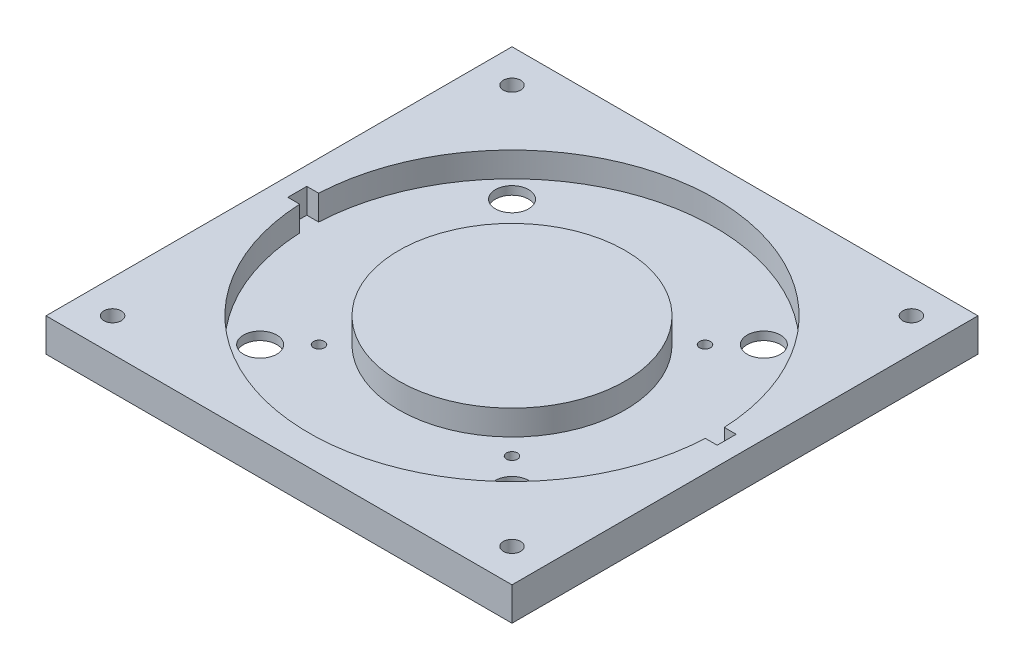
ISO-10303-21;
HEADER;
FILE_DESCRIPTION(('STEP AP214'),'2;1');
FILE_NAME('part.step','',(''),(''),'','','');
FILE_SCHEMA(('AUTOMOTIVE_DESIGN { 1 0 10303 214 1 1 1 1 }'));
ENDSEC;
DATA;
#1=APPLICATION_CONTEXT('core data for automotive mechanical design processes');
#2=APPLICATION_PROTOCOL_DEFINITION('international standard','automotive_design',2000,#1);
#3=PRODUCT_CONTEXT('',#1,'mechanical');
#4=PRODUCT('Part','Part','',(#3));
#5=PRODUCT_RELATED_PRODUCT_CATEGORY('part','',(#4));
#6=PRODUCT_DEFINITION_FORMATION('','',#4);
#7=PRODUCT_DEFINITION_CONTEXT('part definition',#1,'design');
#8=PRODUCT_DEFINITION('design','',#6,#7);
#9=PRODUCT_DEFINITION_SHAPE('','',#8);
#10=(LENGTH_UNIT() NAMED_UNIT(*) SI_UNIT(.MILLI.,.METRE.));
#11=(NAMED_UNIT(*) PLANE_ANGLE_UNIT() SI_UNIT($,.RADIAN.));
#12=(NAMED_UNIT(*) SI_UNIT($,.STERADIAN.) SOLID_ANGLE_UNIT());
#13=UNCERTAINTY_MEASURE_WITH_UNIT(LENGTH_MEASURE(1.E-05),#10,'distance_accuracy_value','');
#14=(GEOMETRIC_REPRESENTATION_CONTEXT(3) GLOBAL_UNCERTAINTY_ASSIGNED_CONTEXT((#13)) GLOBAL_UNIT_ASSIGNED_CONTEXT((#10,
#11,#12)) REPRESENTATION_CONTEXT('',''));
#15=CARTESIAN_POINT('',(0.,0.,0.));
#16=DIRECTION('',(0.,0.,1.));
#17=DIRECTION('',(1.,0.,0.));
#18=AXIS2_PLACEMENT_3D('',#15,#16,#17);
#19=CARTESIAN_POINT('',(0.,2.5,0.));
#20=DIRECTION('',(0.,1.,0.));
#21=DIRECTION('',(0.,0.,1.));
#22=AXIS2_PLACEMENT_3D('',#19,#20,#21);
#23=CYLINDRICAL_SURFACE('',#22,61.);
#24=CARTESIAN_POINT('',(0.,2.5,0.));
#25=DIRECTION('',(0.,1.,0.));
#26=DIRECTION('',(0.,0.,1.));
#27=AXIS2_PLACEMENT_3D('',#24,#25,#26);
#28=CIRCLE('',#27,61.);
#29=CARTESIAN_POINT('',(-60.9333857585478,2.5,2.85));
#30=VERTEX_POINT('',#29);
#31=CARTESIAN_POINT('',(60.9333857585478,2.5,2.85));
#32=VERTEX_POINT('',#31);
#33=EDGE_CURVE('E203',#30,#32,#28,.T.);
#34=ORIENTED_EDGE('',*,*,#33,.F.);
#35=DIRECTION('',(0.,1.,0.));
#36=VECTOR('',#35,1.);
#37=CARTESIAN_POINT('',(-60.9333857585478,2.5,2.85));
#38=LINE('',#37,#36);
#39=CARTESIAN_POINT('',(-60.9333857585478,10.,2.85));
#40=VERTEX_POINT('',#39);
#41=EDGE_CURVE('E181',#30,#40,#38,.T.);
#42=ORIENTED_EDGE('',*,*,#41,.T.);
#43=CARTESIAN_POINT('',(0.,10.,0.));
#44=DIRECTION('',(0.,1.,0.));
#45=DIRECTION('',(0.,0.,1.));
#46=AXIS2_PLACEMENT_3D('',#43,#44,#45);
#47=CIRCLE('',#46,61.);
#48=CARTESIAN_POINT('',(60.9333857585478,10.,2.85));
#49=VERTEX_POINT('',#48);
#50=EDGE_CURVE('E202',#40,#49,#47,.T.);
#51=ORIENTED_EDGE('',*,*,#50,.T.);
#52=DIRECTION('',(0.,1.,0.));
#53=VECTOR('',#52,1.);
#54=CARTESIAN_POINT('',(60.9333857585478,2.5,2.85));
#55=LINE('',#54,#53);
#56=EDGE_CURVE('E177',#49,#32,#55,.F.);
#57=ORIENTED_EDGE('',*,*,#56,.T.);
#58=EDGE_LOOP('',(#34,#42,#51,#57));
#59=FACE_BOUND('',#58,.T.);
#60=ADVANCED_FACE('F34',(#59),#23,.F.);
#61=CARTESIAN_POINT('',(-28.9913780286484,10.,-28.9913780286484));
#62=DIRECTION('',(0.,-1.,0.));
#63=DIRECTION('',(0.,0.,-1.));
#64=AXIS2_PLACEMENT_3D('',#61,#62,#63);
#65=CYLINDRICAL_SURFACE('',#64,1.65);
#66=CARTESIAN_POINT('',(-28.9913780286484,0.,-28.9913780286484));
#67=DIRECTION('',(0.,1.,0.));
#68=DIRECTION('',(0.,0.,1.));
#69=AXIS2_PLACEMENT_3D('',#66,#67,#68);
#70=CIRCLE('',#69,1.65);
#71=CARTESIAN_POINT('',(-28.9913780286484,0.,-27.3413780286484));
#72=VERTEX_POINT('',#71);
#73=EDGE_CURVE('E260',#72,#72,#70,.T.);
#74=ORIENTED_EDGE('',*,*,#73,.F.);
#75=EDGE_LOOP('',(#74));
#76=FACE_BOUND('',#75,.T.);
#77=CARTESIAN_POINT('',(-28.9913780286484,2.5,-28.9913780286484));
#78=DIRECTION('',(0.,1.,0.));
#79=DIRECTION('',(0.,0.,1.));
#80=AXIS2_PLACEMENT_3D('',#77,#78,#79);
#81=CIRCLE('',#80,1.65);
#82=CARTESIAN_POINT('',(-28.9913780286484,2.5,-27.3413780286484));
#83=VERTEX_POINT('',#82);
#84=EDGE_CURVE('E199',#83,#83,#81,.T.);
#85=ORIENTED_EDGE('',*,*,#84,.T.);
#86=EDGE_LOOP('',(#85));
#87=FACE_BOUND('',#86,.T.);
#88=ADVANCED_FACE('F319',(#76,#87),#65,.F.);
#89=CARTESIAN_POINT('',(28.9913780286484,10.,-28.9913780286517));
#90=DIRECTION('',(0.,-1.,0.));
#91=DIRECTION('',(0.,0.,-1.));
#92=AXIS2_PLACEMENT_3D('',#89,#90,#91);
#93=CYLINDRICAL_SURFACE('',#92,1.65);
#94=CARTESIAN_POINT('',(28.9913780286484,0.,-28.9913780286517));
#95=DIRECTION('',(0.,1.,0.));
#96=DIRECTION('',(0.,0.,1.));
#97=AXIS2_PLACEMENT_3D('',#94,#95,#96);
#98=CIRCLE('',#97,1.65);
#99=CARTESIAN_POINT('',(28.9913780286484,0.,-27.3413780286517));
#100=VERTEX_POINT('',#99);
#101=EDGE_CURVE('E254',#100,#100,#98,.T.);
#102=ORIENTED_EDGE('',*,*,#101,.F.);
#103=EDGE_LOOP('',(#102));
#104=FACE_BOUND('',#103,.T.);
#105=CARTESIAN_POINT('',(28.9913780286484,2.5,-28.9913780286517));
#106=DIRECTION('',(0.,1.,0.));
#107=DIRECTION('',(0.,0.,1.));
#108=AXIS2_PLACEMENT_3D('',#105,#106,#107);
#109=CIRCLE('',#108,1.65);
#110=CARTESIAN_POINT('',(28.9913780286484,2.5,-27.3413780286517));
#111=VERTEX_POINT('',#110);
#112=EDGE_CURVE('E196',#111,#111,#109,.T.);
#113=ORIENTED_EDGE('',*,*,#112,.T.);
#114=EDGE_LOOP('',(#113));
#115=FACE_BOUND('',#114,.T.);
#116=ADVANCED_FACE('F326',(#104,#115),#93,.F.);
#117=CARTESIAN_POINT('',(28.9913780286517,10.,28.9913780286451));
#118=DIRECTION('',(0.,-1.,0.));
#119=DIRECTION('',(0.,0.,-1.));
#120=AXIS2_PLACEMENT_3D('',#117,#118,#119);
#121=CYLINDRICAL_SURFACE('',#120,1.65);
#122=CARTESIAN_POINT('',(28.9913780286517,0.,28.9913780286451));
#123=DIRECTION('',(0.,1.,0.));
#124=DIRECTION('',(0.,0.,1.));
#125=AXIS2_PLACEMENT_3D('',#122,#123,#124);
#126=CIRCLE('',#125,1.65);
#127=CARTESIAN_POINT('',(28.9913780286517,0.,30.6413780286451));
#128=VERTEX_POINT('',#127);
#129=EDGE_CURVE('E248',#128,#128,#126,.T.);
#130=ORIENTED_EDGE('',*,*,#129,.F.);
#131=EDGE_LOOP('',(#130));
#132=FACE_BOUND('',#131,.T.);
#133=CARTESIAN_POINT('',(28.9913780286517,2.5,28.9913780286451));
#134=DIRECTION('',(0.,1.,0.));
#135=DIRECTION('',(0.,0.,1.));
#136=AXIS2_PLACEMENT_3D('',#133,#134,#135);
#137=CIRCLE('',#136,1.65);
#138=CARTESIAN_POINT('',(28.9913780286517,2.5,30.6413780286451));
#139=VERTEX_POINT('',#138);
#140=EDGE_CURVE('E193',#139,#139,#137,.T.);
#141=ORIENTED_EDGE('',*,*,#140,.T.);
#142=EDGE_LOOP('',(#141));
#143=FACE_BOUND('',#142,.T.);
#144=ADVANCED_FACE('F411',(#132,#143),#121,.F.);
#145=CARTESIAN_POINT('',(-28.9913780286451,10.,28.9913780286484));
#146=DIRECTION('',(0.,-1.,0.));
#147=DIRECTION('',(0.,0.,-1.));
#148=AXIS2_PLACEMENT_3D('',#145,#146,#147);
#149=CYLINDRICAL_SURFACE('',#148,1.65);
#150=CARTESIAN_POINT('',(-28.9913780286451,0.,28.9913780286484));
#151=DIRECTION('',(0.,1.,0.));
#152=DIRECTION('',(0.,0.,1.));
#153=AXIS2_PLACEMENT_3D('',#150,#151,#152);
#154=CIRCLE('',#153,1.65);
#155=CARTESIAN_POINT('',(-28.9913780286451,0.,30.6413780286484));
#156=VERTEX_POINT('',#155);
#157=EDGE_CURVE('E240',#156,#156,#154,.T.);
#158=ORIENTED_EDGE('',*,*,#157,.F.);
#159=EDGE_LOOP('',(#158));
#160=FACE_BOUND('',#159,.T.);
#161=CARTESIAN_POINT('',(-28.9913780286451,2.5,28.9913780286484));
#162=DIRECTION('',(0.,1.,0.));
#163=DIRECTION('',(0.,0.,1.));
#164=AXIS2_PLACEMENT_3D('',#161,#162,#163);
#165=CIRCLE('',#164,1.65);
#166=CARTESIAN_POINT('',(-28.9913780286451,2.5,30.6413780286484));
#167=VERTEX_POINT('',#166);
#168=EDGE_CURVE('E188',#167,#167,#165,.T.);
#169=ORIENTED_EDGE('',*,*,#168,.T.);
#170=EDGE_LOOP('',(#169));
#171=FACE_BOUND('',#170,.T.);
#172=ADVANCED_FACE('F409',(#160,#171),#149,.F.);
#173=CARTESIAN_POINT('',(-37.8302127934803,10.,-37.8302127934803));
#174=DIRECTION('',(0.,-1.,0.));
#175=DIRECTION('',(0.,0.,-1.));
#176=AXIS2_PLACEMENT_3D('',#173,#174,#175);
#177=CYLINDRICAL_SURFACE('',#176,5.);
#178=CARTESIAN_POINT('',(-37.8302127934803,0.,-37.8302127934803));
#179=DIRECTION('',(0.,1.,0.));
#180=DIRECTION('',(0.,0.,1.));
#181=AXIS2_PLACEMENT_3D('',#178,#179,#180);
#182=CIRCLE('',#181,5.);
#183=CARTESIAN_POINT('',(-37.8302127934803,0.,-32.8302127934803));
#184=VERTEX_POINT('',#183);
#185=EDGE_CURVE('E263',#184,#184,#182,.T.);
#186=ORIENTED_EDGE('',*,*,#185,.F.);
#187=EDGE_LOOP('',(#186));
#188=FACE_BOUND('',#187,.T.);
#189=CARTESIAN_POINT('',(-37.8302127934803,2.5,-37.8302127934803));
#190=DIRECTION('',(0.,1.,0.));
#191=DIRECTION('',(0.,0.,1.));
#192=AXIS2_PLACEMENT_3D('',#189,#190,#191);
#193=CIRCLE('',#192,5.);
#194=CARTESIAN_POINT('',(-37.8302127934803,2.5,-32.8302127934803));
#195=VERTEX_POINT('',#194);
#196=EDGE_CURVE('E215',#195,#195,#193,.T.);
#197=ORIENTED_EDGE('',*,*,#196,.T.);
#198=EDGE_LOOP('',(#197));
#199=FACE_BOUND('',#198,.T.);
#200=ADVANCED_FACE('F419',(#188,#199),#177,.F.);
#201=CARTESIAN_POINT('',(37.8302127934803,10.,-37.8302127934835));
#202=DIRECTION('',(0.,-1.,0.));
#203=DIRECTION('',(0.,0.,-1.));
#204=AXIS2_PLACEMENT_3D('',#201,#202,#203);
#205=CYLINDRICAL_SURFACE('',#204,5.);
#206=CARTESIAN_POINT('',(37.8302127934803,0.,-37.8302127934835));
#207=DIRECTION('',(0.,1.,0.));
#208=DIRECTION('',(0.,0.,1.));
#209=AXIS2_PLACEMENT_3D('',#206,#207,#208);
#210=CIRCLE('',#209,5.);
#211=CARTESIAN_POINT('',(37.8302127934803,0.,-32.8302127934835));
#212=VERTEX_POINT('',#211);
#213=EDGE_CURVE('E257',#212,#212,#210,.T.);
#214=ORIENTED_EDGE('',*,*,#213,.F.);
#215=EDGE_LOOP('',(#214));
#216=FACE_BOUND('',#215,.T.);
#217=CARTESIAN_POINT('',(37.8302127934803,2.5,-37.8302127934835));
#218=DIRECTION('',(0.,1.,0.));
#219=DIRECTION('',(0.,0.,1.));
#220=AXIS2_PLACEMENT_3D('',#217,#218,#219);
#221=CIRCLE('',#220,5.);
#222=CARTESIAN_POINT('',(37.8302127934803,2.5,-32.8302127934835));
#223=VERTEX_POINT('',#222);
#224=EDGE_CURVE('E212',#223,#223,#221,.T.);
#225=ORIENTED_EDGE('',*,*,#224,.T.);
#226=EDGE_LOOP('',(#225));
#227=FACE_BOUND('',#226,.T.);
#228=ADVANCED_FACE('F403',(#216,#227),#205,.F.);
#229=CARTESIAN_POINT('',(37.8302127934835,10.,37.830212793477));
#230=DIRECTION('',(0.,-1.,0.));
#231=DIRECTION('',(0.,0.,-1.));
#232=AXIS2_PLACEMENT_3D('',#229,#230,#231);
#233=CYLINDRICAL_SURFACE('',#232,5.);
#234=CARTESIAN_POINT('',(37.8302127934835,0.,37.830212793477));
#235=DIRECTION('',(0.,1.,0.));
#236=DIRECTION('',(0.,0.,1.));
#237=AXIS2_PLACEMENT_3D('',#234,#235,#236);
#238=CIRCLE('',#237,5.);
#239=CARTESIAN_POINT('',(37.8302127934835,0.,42.830212793477));
#240=VERTEX_POINT('',#239);
#241=EDGE_CURVE('E251',#240,#240,#238,.T.);
#242=ORIENTED_EDGE('',*,*,#241,.F.);
#243=EDGE_LOOP('',(#242));
#244=FACE_BOUND('',#243,.T.);
#245=CARTESIAN_POINT('',(37.8302127934835,2.5,37.830212793477));
#246=DIRECTION('',(0.,1.,0.));
#247=DIRECTION('',(0.,0.,1.));
#248=AXIS2_PLACEMENT_3D('',#245,#246,#247);
#249=CIRCLE('',#248,5.);
#250=CARTESIAN_POINT('',(37.8302127934835,2.5,42.830212793477));
#251=VERTEX_POINT('',#250);
#252=EDGE_CURVE('E209',#251,#251,#249,.T.);
#253=ORIENTED_EDGE('',*,*,#252,.T.);
#254=EDGE_LOOP('',(#253));
#255=FACE_BOUND('',#254,.T.);
#256=ADVANCED_FACE('F397',(#244,#255),#233,.F.);
#257=CARTESIAN_POINT('',(-37.830212793477,10.,37.8302127934803));
#258=DIRECTION('',(0.,-1.,0.));
#259=DIRECTION('',(0.,0.,-1.));
#260=AXIS2_PLACEMENT_3D('',#257,#258,#259);
#261=CYLINDRICAL_SURFACE('',#260,5.);
#262=CARTESIAN_POINT('',(-37.830212793477,0.,37.8302127934803));
#263=DIRECTION('',(0.,1.,0.));
#264=DIRECTION('',(0.,0.,1.));
#265=AXIS2_PLACEMENT_3D('',#262,#263,#264);
#266=CIRCLE('',#265,5.);
#267=CARTESIAN_POINT('',(-37.830212793477,0.,42.8302127934803));
#268=VERTEX_POINT('',#267);
#269=EDGE_CURVE('E245',#268,#268,#266,.T.);
#270=ORIENTED_EDGE('',*,*,#269,.F.);
#271=EDGE_LOOP('',(#270));
#272=FACE_BOUND('',#271,.T.);
#273=CARTESIAN_POINT('',(-37.830212793477,2.5,37.8302127934803));
#274=DIRECTION('',(0.,1.,0.));
#275=DIRECTION('',(0.,0.,1.));
#276=AXIS2_PLACEMENT_3D('',#273,#274,#275);
#277=CIRCLE('',#276,5.);
#278=CARTESIAN_POINT('',(-37.830212793477,2.5,42.8302127934803));
#279=VERTEX_POINT('',#278);
#280=EDGE_CURVE('E38',#279,#279,#277,.T.);
#281=ORIENTED_EDGE('',*,*,#280,.T.);
#282=EDGE_LOOP('',(#281));
#283=FACE_BOUND('',#282,.T.);
#284=ADVANCED_FACE('F364',(#272,#283),#261,.F.);
#285=CARTESIAN_POINT('',(0.,10.,0.));
#286=DIRECTION('',(0.,-1.,0.));
#287=DIRECTION('',(0.,0.,-1.));
#288=AXIS2_PLACEMENT_3D('',#285,#286,#287);
#289=PLANE('',#288);
#290=ORIENTED_EDGE('',*,*,#50,.F.);
#291=DIRECTION('',(1.,0.,0.));
#292=VECTOR('',#291,1.);
#293=CARTESIAN_POINT('',(-64.5,10.,2.85));
#294=LINE('',#293,#292);
#295=CARTESIAN_POINT('',(-64.5,10.,2.85));
#296=VERTEX_POINT('',#295);
#297=EDGE_CURVE('E145',#296,#40,#294,.T.);
#298=ORIENTED_EDGE('',*,*,#297,.F.);
#299=DIRECTION('',(0.,0.,1.));
#300=VECTOR('',#299,1.);
#301=CARTESIAN_POINT('',(-64.5,10.,-2.85));
#302=LINE('',#301,#300);
#303=CARTESIAN_POINT('',(-64.5,10.,-2.85));
#304=VERTEX_POINT('',#303);
#305=EDGE_CURVE('E136',#304,#296,#302,.T.);
#306=ORIENTED_EDGE('',*,*,#305,.F.);
#307=DIRECTION('',(-1.,0.,0.));
#308=VECTOR('',#307,1.);
#309=CARTESIAN_POINT('',(-64.5,10.,-2.85));
#310=LINE('',#309,#308);
#311=CARTESIAN_POINT('',(-60.9333857585478,10.,-2.85));
#312=VERTEX_POINT('',#311);
#313=EDGE_CURVE('E125',#312,#304,#310,.T.);
#314=ORIENTED_EDGE('',*,*,#313,.F.);
#315=CARTESIAN_POINT('',(60.9333857585478,10.,-2.85));
#316=VERTEX_POINT('',#315);
#317=EDGE_CURVE('E206',#316,#312,#47,.T.);
#318=ORIENTED_EDGE('',*,*,#317,.F.);
#319=DIRECTION('',(-1.,0.,0.));
#320=VECTOR('',#319,1.);
#321=CARTESIAN_POINT('',(64.5000000000001,10.,-2.85));
#322=LINE('',#321,#320);
#323=CARTESIAN_POINT('',(64.5000000000001,10.,-2.85));
#324=VERTEX_POINT('',#323);
#325=EDGE_CURVE('E166',#324,#316,#322,.T.);
#326=ORIENTED_EDGE('',*,*,#325,.F.);
#327=DIRECTION('',(0.,0.,-1.));
#328=VECTOR('',#327,1.);
#329=CARTESIAN_POINT('',(64.5000000000001,10.,-2.85));
#330=LINE('',#329,#328);
#331=CARTESIAN_POINT('',(64.5000000000001,10.,2.85));
#332=VERTEX_POINT('',#331);
#333=EDGE_CURVE('E163',#332,#324,#330,.T.);
#334=ORIENTED_EDGE('',*,*,#333,.F.);
#335=DIRECTION('',(1.,0.,0.));
#336=VECTOR('',#335,1.);
#337=CARTESIAN_POINT('',(64.5000000000001,10.,2.85));
#338=LINE('',#337,#336);
#339=EDGE_CURVE('E168',#49,#332,#338,.T.);
#340=ORIENTED_EDGE('',*,*,#339,.F.);
#341=EDGE_LOOP('',(#290,#298,#306,#314,#318,#326,#334,#340));
#342=FACE_BOUND('',#341,.T.);
#343=CARTESIAN_POINT('',(-60.,10.,60.0000000000001));
#344=DIRECTION('',(0.,1.,0.));
#345=DIRECTION('',(0.,0.,1.));
#346=AXIS2_PLACEMENT_3D('',#343,#344,#345);
#347=CIRCLE('',#346,2.6);
#348=CARTESIAN_POINT('',(-60.,10.,62.6000000000001));
#349=VERTEX_POINT('',#348);
#350=EDGE_CURVE('E218',#349,#349,#347,.T.);
#351=ORIENTED_EDGE('',*,*,#350,.F.);
#352=EDGE_LOOP('',(#351));
#353=FACE_BOUND('',#352,.T.);
#354=CARTESIAN_POINT('',(60.0000000000001,10.,60.));
#355=DIRECTION('',(0.,1.,0.));
#356=DIRECTION('',(0.,0.,1.));
#357=AXIS2_PLACEMENT_3D('',#354,#355,#356);
#358=CIRCLE('',#357,2.59999999999999);
#359=CARTESIAN_POINT('',(60.0000000000001,10.,62.6));
#360=VERTEX_POINT('',#359);
#361=EDGE_CURVE('E229',#360,#360,#358,.T.);
#362=ORIENTED_EDGE('',*,*,#361,.F.);
#363=EDGE_LOOP('',(#362));
#364=FACE_BOUND('',#363,.T.);
#365=CARTESIAN_POINT('',(60.,10.,-60.0000000000001));
#366=DIRECTION('',(0.,1.,0.));
#367=DIRECTION('',(0.,0.,1.));
#368=AXIS2_PLACEMENT_3D('',#365,#366,#367);
#369=CIRCLE('',#368,2.6);
#370=CARTESIAN_POINT('',(60.,10.,-57.4000000000001));
#371=VERTEX_POINT('',#370);
#372=EDGE_CURVE('E223',#371,#371,#369,.T.);
#373=ORIENTED_EDGE('',*,*,#372,.F.);
#374=EDGE_LOOP('',(#373));
#375=FACE_BOUND('',#374,.T.);
#376=CARTESIAN_POINT('',(-60.0000000000001,10.,-60.));
#377=DIRECTION('',(0.,1.,0.));
#378=DIRECTION('',(0.,0.,1.));
#379=AXIS2_PLACEMENT_3D('',#376,#377,#378);
#380=CIRCLE('',#379,2.6);
#381=CARTESIAN_POINT('',(-60.0000000000001,10.,-57.4));
#382=VERTEX_POINT('',#381);
#383=EDGE_CURVE('E222',#382,#382,#380,.T.);
#384=ORIENTED_EDGE('',*,*,#383,.F.);
#385=EDGE_LOOP('',(#384));
#386=FACE_BOUND('',#385,.T.);
#387=DIRECTION('',(0.,0.,-1.));
#388=VECTOR('',#387,1.);
#389=CARTESIAN_POINT('',(70.,10.,70.));
#390=LINE('',#389,#388);
#391=CARTESIAN_POINT('',(70.,10.,70.));
#392=VERTEX_POINT('',#391);
#393=CARTESIAN_POINT('',(70.,10.,-70.));
#394=VERTEX_POINT('',#393);
#395=EDGE_CURVE('E267',#392,#394,#390,.T.);
#396=ORIENTED_EDGE('',*,*,#395,.T.);
#397=DIRECTION('',(-1.,0.,0.));
#398=VECTOR('',#397,1.);
#399=CARTESIAN_POINT('',(-70.,10.,-70.));
#400=LINE('',#399,#398);
#401=CARTESIAN_POINT('',(-70.,10.,-70.));
#402=VERTEX_POINT('',#401);
#403=EDGE_CURVE('E270',#394,#402,#400,.T.);
#404=ORIENTED_EDGE('',*,*,#403,.T.);
#405=DIRECTION('',(0.,0.,1.));
#406=VECTOR('',#405,1.);
#407=CARTESIAN_POINT('',(-70.,10.,70.));
#408=LINE('',#407,#406);
#409=CARTESIAN_POINT('',(-70.,10.,70.));
#410=VERTEX_POINT('',#409);
#411=EDGE_CURVE('E273',#402,#410,#408,.T.);
#412=ORIENTED_EDGE('',*,*,#411,.T.);
#413=DIRECTION('',(1.,0.,0.));
#414=VECTOR('',#413,1.);
#415=CARTESIAN_POINT('',(-70.,10.,70.));
#416=LINE('',#415,#414);
#417=EDGE_CURVE('E275',#410,#392,#416,.T.);
#418=ORIENTED_EDGE('',*,*,#417,.T.);
#419=EDGE_LOOP('',(#396,#404,#412,#418));
#420=FACE_BOUND('',#419,.T.);
#421=ADVANCED_FACE('F148',(#342,#353,#364,#375,#386,#420),#289,.F.);
#422=CARTESIAN_POINT('',(0.,0.,0.));
#423=DIRECTION('',(0.,-1.,0.));
#424=DIRECTION('',(0.,0.,-1.));
#425=AXIS2_PLACEMENT_3D('',#422,#423,#424);
#426=PLANE('',#425);
#427=CARTESIAN_POINT('',(-60.,0.,60.0000000000001));
#428=DIRECTION('',(0.,1.,0.));
#429=DIRECTION('',(0.,0.,1.));
#430=AXIS2_PLACEMENT_3D('',#427,#428,#429);
#431=CIRCLE('',#430,2.6);
#432=CARTESIAN_POINT('',(-60.,0.,62.6000000000001));
#433=VERTEX_POINT('',#432);
#434=EDGE_CURVE('E232',#433,#433,#431,.T.);
#435=ORIENTED_EDGE('',*,*,#434,.T.);
#436=EDGE_LOOP('',(#435));
#437=FACE_BOUND('',#436,.T.);
#438=CARTESIAN_POINT('',(60.0000000000001,0.,60.));
#439=DIRECTION('',(0.,1.,0.));
#440=DIRECTION('',(0.,0.,1.));
#441=AXIS2_PLACEMENT_3D('',#438,#439,#440);
#442=CIRCLE('',#441,2.59999999999999);
#443=CARTESIAN_POINT('',(60.0000000000001,0.,62.6));
#444=VERTEX_POINT('',#443);
#445=EDGE_CURVE('E226',#444,#444,#442,.T.);
#446=ORIENTED_EDGE('',*,*,#445,.T.);
#447=EDGE_LOOP('',(#446));
#448=FACE_BOUND('',#447,.T.);
#449=CARTESIAN_POINT('',(60.,0.,-60.0000000000001));
#450=DIRECTION('',(0.,1.,0.));
#451=DIRECTION('',(0.,0.,1.));
#452=AXIS2_PLACEMENT_3D('',#449,#450,#451);
#453=CIRCLE('',#452,2.6);
#454=CARTESIAN_POINT('',(60.,0.,-57.4000000000001));
#455=VERTEX_POINT('',#454);
#456=EDGE_CURVE('E219',#455,#455,#453,.T.);
#457=ORIENTED_EDGE('',*,*,#456,.T.);
#458=EDGE_LOOP('',(#457));
#459=FACE_BOUND('',#458,.T.);
#460=CARTESIAN_POINT('',(-60.0000000000001,0.,-60.));
#461=DIRECTION('',(0.,1.,0.));
#462=DIRECTION('',(0.,0.,1.));
#463=AXIS2_PLACEMENT_3D('',#460,#461,#462);
#464=CIRCLE('',#463,2.6);
#465=CARTESIAN_POINT('',(-60.0000000000001,0.,-57.4));
#466=VERTEX_POINT('',#465);
#467=EDGE_CURVE('E237',#466,#466,#464,.T.);
#468=ORIENTED_EDGE('',*,*,#467,.T.);
#469=EDGE_LOOP('',(#468));
#470=FACE_BOUND('',#469,.T.);
#471=ORIENTED_EDGE('',*,*,#269,.T.);
#472=EDGE_LOOP('',(#471));
#473=FACE_BOUND('',#472,.T.);
#474=ORIENTED_EDGE('',*,*,#241,.T.);
#475=EDGE_LOOP('',(#474));
#476=FACE_BOUND('',#475,.T.);
#477=ORIENTED_EDGE('',*,*,#213,.T.);
#478=EDGE_LOOP('',(#477));
#479=FACE_BOUND('',#478,.T.);
#480=ORIENTED_EDGE('',*,*,#185,.T.);
#481=EDGE_LOOP('',(#480));
#482=FACE_BOUND('',#481,.T.);
#483=DIRECTION('',(0.,0.,-1.));
#484=VECTOR('',#483,1.);
#485=CARTESIAN_POINT('',(70.,0.,70.));
#486=LINE('',#485,#484);
#487=CARTESIAN_POINT('',(70.,0.,70.));
#488=VERTEX_POINT('',#487);
#489=CARTESIAN_POINT('',(70.,0.,-70.));
#490=VERTEX_POINT('',#489);
#491=EDGE_CURVE('E266',#488,#490,#486,.T.);
#492=ORIENTED_EDGE('',*,*,#491,.F.);
#493=DIRECTION('',(1.,0.,0.));
#494=VECTOR('',#493,1.);
#495=CARTESIAN_POINT('',(-70.,0.,70.));
#496=LINE('',#495,#494);
#497=CARTESIAN_POINT('',(-70.,0.,70.));
#498=VERTEX_POINT('',#497);
#499=EDGE_CURVE('E271',#498,#488,#496,.T.);
#500=ORIENTED_EDGE('',*,*,#499,.F.);
#501=DIRECTION('',(0.,0.,1.));
#502=VECTOR('',#501,1.);
#503=CARTESIAN_POINT('',(-70.,0.,70.));
#504=LINE('',#503,#502);
#505=CARTESIAN_POINT('',(-70.,0.,-70.));
#506=VERTEX_POINT('',#505);
#507=EDGE_CURVE('E282',#506,#498,#504,.T.);
#508=ORIENTED_EDGE('',*,*,#507,.F.);
#509=DIRECTION('',(-1.,0.,0.));
#510=VECTOR('',#509,1.);
#511=CARTESIAN_POINT('',(-70.,0.,-70.));
#512=LINE('',#511,#510);
#513=EDGE_CURVE('E280',#490,#506,#512,.T.);
#514=ORIENTED_EDGE('',*,*,#513,.F.);
#515=EDGE_LOOP('',(#492,#500,#508,#514));
#516=FACE_BOUND('',#515,.T.);
#517=ORIENTED_EDGE('',*,*,#73,.T.);
#518=EDGE_LOOP('',(#517));
#519=FACE_BOUND('',#518,.T.);
#520=ORIENTED_EDGE('',*,*,#101,.T.);
#521=EDGE_LOOP('',(#520));
#522=FACE_BOUND('',#521,.T.);
#523=ORIENTED_EDGE('',*,*,#129,.T.);
#524=EDGE_LOOP('',(#523));
#525=FACE_BOUND('',#524,.T.);
#526=ORIENTED_EDGE('',*,*,#157,.T.);
#527=EDGE_LOOP('',(#526));
#528=FACE_BOUND('',#527,.T.);
#529=ADVANCED_FACE('F301',(#437,#448,#459,#470,#473,#476,#479,#482,#516,#519,#522,#525,#528),
#426,.T.);
#530=CARTESIAN_POINT('',(70.,10.,70.));
#531=DIRECTION('',(-1.,0.,0.));
#532=DIRECTION('',(0.,0.,1.));
#533=AXIS2_PLACEMENT_3D('',#530,#531,#532);
#534=PLANE('',#533);
#535=ORIENTED_EDGE('',*,*,#491,.T.);
#536=DIRECTION('',(0.,-1.,0.));
#537=VECTOR('',#536,1.);
#538=CARTESIAN_POINT('',(70.,10.,-70.));
#539=LINE('',#538,#537);
#540=EDGE_CURVE('E11',#394,#490,#539,.T.);
#541=ORIENTED_EDGE('',*,*,#540,.F.);
#542=ORIENTED_EDGE('',*,*,#395,.F.);
#543=DIRECTION('',(0.,-1.,0.));
#544=VECTOR('',#543,1.);
#545=CARTESIAN_POINT('',(70.,10.,70.));
#546=LINE('',#545,#544);
#547=EDGE_CURVE('E277',#392,#488,#546,.T.);
#548=ORIENTED_EDGE('',*,*,#547,.T.);
#549=EDGE_LOOP('',(#535,#541,#542,#548));
#550=FACE_BOUND('',#549,.T.);
#551=ADVANCED_FACE('F36',(#550),#534,.F.);
#552=CARTESIAN_POINT('',(-70.,10.,-70.));
#553=DIRECTION('',(0.,0.,1.));
#554=DIRECTION('',(1.,0.,0.));
#555=AXIS2_PLACEMENT_3D('',#552,#553,#554);
#556=PLANE('',#555);
#557=ORIENTED_EDGE('',*,*,#513,.T.);
#558=DIRECTION('',(0.,-1.,0.));
#559=VECTOR('',#558,1.);
#560=CARTESIAN_POINT('',(-70.,10.,-70.));
#561=LINE('',#560,#559);
#562=EDGE_CURVE('E43',#402,#506,#561,.T.);
#563=ORIENTED_EDGE('',*,*,#562,.F.);
#564=ORIENTED_EDGE('',*,*,#403,.F.);
#565=ORIENTED_EDGE('',*,*,#540,.T.);
#566=EDGE_LOOP('',(#557,#563,#564,#565));
#567=FACE_BOUND('',#566,.T.);
#568=ADVANCED_FACE('F311',(#567),#556,.F.);
#569=CARTESIAN_POINT('',(-70.,10.,70.));
#570=DIRECTION('',(1.,0.,0.));
#571=DIRECTION('',(0.,0.,-1.));
#572=AXIS2_PLACEMENT_3D('',#569,#570,#571);
#573=PLANE('',#572);
#574=ORIENTED_EDGE('',*,*,#507,.T.);
#575=DIRECTION('',(0.,-1.,0.));
#576=VECTOR('',#575,1.);
#577=CARTESIAN_POINT('',(-70.,10.,70.));
#578=LINE('',#577,#576);
#579=EDGE_CURVE('E287',#410,#498,#578,.T.);
#580=ORIENTED_EDGE('',*,*,#579,.F.);
#581=ORIENTED_EDGE('',*,*,#411,.F.);
#582=ORIENTED_EDGE('',*,*,#562,.T.);
#583=EDGE_LOOP('',(#574,#580,#581,#582));
#584=FACE_BOUND('',#583,.T.);
#585=ADVANCED_FACE('F295',(#584),#573,.F.);
#586=CARTESIAN_POINT('',(-70.,10.,70.));
#587=DIRECTION('',(0.,0.,-1.));
#588=DIRECTION('',(-1.,0.,0.));
#589=AXIS2_PLACEMENT_3D('',#586,#587,#588);
#590=PLANE('',#589);
#591=ORIENTED_EDGE('',*,*,#499,.T.);
#592=ORIENTED_EDGE('',*,*,#547,.F.);
#593=ORIENTED_EDGE('',*,*,#417,.F.);
#594=ORIENTED_EDGE('',*,*,#579,.T.);
#595=EDGE_LOOP('',(#591,#592,#593,#594));
#596=FACE_BOUND('',#595,.T.);
#597=ADVANCED_FACE('F305',(#596),#590,.F.);
#598=CARTESIAN_POINT('',(-60.0000000000001,0.,-60.));
#599=DIRECTION('',(0.,1.,0.));
#600=DIRECTION('',(0.,0.,1.));
#601=AXIS2_PLACEMENT_3D('',#598,#599,#600);
#602=CYLINDRICAL_SURFACE('',#601,2.6);
#603=ORIENTED_EDGE('',*,*,#467,.F.);
#604=EDGE_LOOP('',(#603));
#605=FACE_BOUND('',#604,.T.);
#606=ORIENTED_EDGE('',*,*,#383,.T.);
#607=EDGE_LOOP('',(#606));
#608=FACE_BOUND('',#607,.T.);
#609=ADVANCED_FACE('F502',(#605,#608),#602,.F.);
#610=CARTESIAN_POINT('',(60.,0.,-60.0000000000001));
#611=DIRECTION('',(0.,1.,0.));
#612=DIRECTION('',(0.,0.,1.));
#613=AXIS2_PLACEMENT_3D('',#610,#611,#612);
#614=CYLINDRICAL_SURFACE('',#613,2.6);
#615=ORIENTED_EDGE('',*,*,#456,.F.);
#616=EDGE_LOOP('',(#615));
#617=FACE_BOUND('',#616,.T.);
#618=ORIENTED_EDGE('',*,*,#372,.T.);
#619=EDGE_LOOP('',(#618));
#620=FACE_BOUND('',#619,.T.);
#621=ADVANCED_FACE('F492',(#617,#620),#614,.F.);
#622=CARTESIAN_POINT('',(60.0000000000001,0.,60.));
#623=DIRECTION('',(0.,1.,0.));
#624=DIRECTION('',(0.,0.,1.));
#625=AXIS2_PLACEMENT_3D('',#622,#623,#624);
#626=CYLINDRICAL_SURFACE('',#625,2.59999999999999);
#627=ORIENTED_EDGE('',*,*,#445,.F.);
#628=EDGE_LOOP('',(#627));
#629=FACE_BOUND('',#628,.T.);
#630=ORIENTED_EDGE('',*,*,#361,.T.);
#631=EDGE_LOOP('',(#630));
#632=FACE_BOUND('',#631,.T.);
#633=ADVANCED_FACE('F341',(#629,#632),#626,.F.);
#634=CARTESIAN_POINT('',(-60.,0.,60.0000000000001));
#635=DIRECTION('',(0.,1.,0.));
#636=DIRECTION('',(0.,0.,1.));
#637=AXIS2_PLACEMENT_3D('',#634,#635,#636);
#638=CYLINDRICAL_SURFACE('',#637,2.6);
#639=ORIENTED_EDGE('',*,*,#434,.F.);
#640=EDGE_LOOP('',(#639));
#641=FACE_BOUND('',#640,.T.);
#642=ORIENTED_EDGE('',*,*,#350,.T.);
#643=EDGE_LOOP('',(#642));
#644=FACE_BOUND('',#643,.T.);
#645=ADVANCED_FACE('F334',(#641,#644),#638,.F.);
#646=ORIENTED_EDGE('',*,*,#317,.T.);
#647=DIRECTION('',(0.,1.,0.));
#648=VECTOR('',#647,1.);
#649=CARTESIAN_POINT('',(-60.9333857585478,2.5,-2.85));
#650=LINE('',#649,#648);
#651=CARTESIAN_POINT('',(-60.9333857585478,2.5,-2.85));
#652=VERTEX_POINT('',#651);
#653=EDGE_CURVE('E131',#312,#652,#650,.F.);
#654=ORIENTED_EDGE('',*,*,#653,.T.);
#655=CARTESIAN_POINT('',(60.9333857585478,2.5,-2.85));
#656=VERTEX_POINT('',#655);
#657=EDGE_CURVE('E205',#656,#652,#28,.T.);
#658=ORIENTED_EDGE('',*,*,#657,.F.);
#659=DIRECTION('',(0.,1.,0.));
#660=VECTOR('',#659,1.);
#661=CARTESIAN_POINT('',(60.9333857585478,2.5,-2.85));
#662=LINE('',#661,#660);
#663=EDGE_CURVE('E157',#656,#316,#662,.T.);
#664=ORIENTED_EDGE('',*,*,#663,.T.);
#665=EDGE_LOOP('',(#646,#654,#658,#664));
#666=FACE_BOUND('',#665,.T.);
#667=ADVANCED_FACE('F322',(#666),#23,.F.);
#668=CARTESIAN_POINT('',(0.,2.5,0.));
#669=DIRECTION('',(0.,1.,0.));
#670=DIRECTION('',(0.,0.,1.));
#671=AXIS2_PLACEMENT_3D('',#668,#669,#670);
#672=PLANE('',#671);
#673=ORIENTED_EDGE('',*,*,#33,.T.);
#674=DIRECTION('',(-1.,0.,0.));
#675=VECTOR('',#674,1.);
#676=CARTESIAN_POINT('',(64.5000000000001,2.5,2.85));
#677=LINE('',#676,#675);
#678=CARTESIAN_POINT('',(64.5000000000001,2.5,2.85));
#679=VERTEX_POINT('',#678);
#680=EDGE_CURVE('E158',#679,#32,#677,.T.);
#681=ORIENTED_EDGE('',*,*,#680,.F.);
#682=DIRECTION('',(0.,0.,1.));
#683=VECTOR('',#682,1.);
#684=CARTESIAN_POINT('',(64.5000000000001,2.5,-2.85));
#685=LINE('',#684,#683);
#686=CARTESIAN_POINT('',(64.5000000000001,2.5,-2.85));
#687=VERTEX_POINT('',#686);
#688=EDGE_CURVE('E160',#687,#679,#685,.T.);
#689=ORIENTED_EDGE('',*,*,#688,.F.);
#690=DIRECTION('',(1.,0.,0.));
#691=VECTOR('',#690,1.);
#692=CARTESIAN_POINT('',(64.5000000000001,2.5,-2.85));
#693=LINE('',#692,#691);
#694=EDGE_CURVE('E57',#656,#687,#693,.T.);
#695=ORIENTED_EDGE('',*,*,#694,.F.);
#696=ORIENTED_EDGE('',*,*,#657,.T.);
#697=DIRECTION('',(1.,0.,0.));
#698=VECTOR('',#697,1.);
#699=CARTESIAN_POINT('',(-64.5,2.5,-2.85));
#700=LINE('',#699,#698);
#701=CARTESIAN_POINT('',(-64.5,2.5,-2.85));
#702=VERTEX_POINT('',#701);
#703=EDGE_CURVE('E155',#702,#652,#700,.T.);
#704=ORIENTED_EDGE('',*,*,#703,.F.);
#705=DIRECTION('',(0.,0.,-1.));
#706=VECTOR('',#705,1.);
#707=CARTESIAN_POINT('',(-64.5,2.5,-2.85));
#708=LINE('',#707,#706);
#709=CARTESIAN_POINT('',(-64.5,2.5,2.85));
#710=VERTEX_POINT('',#709);
#711=EDGE_CURVE('E143',#710,#702,#708,.T.);
#712=ORIENTED_EDGE('',*,*,#711,.F.);
#713=DIRECTION('',(-1.,0.,0.));
#714=VECTOR('',#713,1.);
#715=CARTESIAN_POINT('',(-64.5,2.5,2.85));
#716=LINE('',#715,#714);
#717=EDGE_CURVE('E50',#30,#710,#716,.T.);
#718=ORIENTED_EDGE('',*,*,#717,.F.);
#719=EDGE_LOOP('',(#673,#681,#689,#695,#696,#704,#712,#718));
#720=FACE_BOUND('',#719,.T.);
#721=ORIENTED_EDGE('',*,*,#196,.F.);
#722=EDGE_LOOP('',(#721));
#723=FACE_BOUND('',#722,.T.);
#724=ORIENTED_EDGE('',*,*,#224,.F.);
#725=EDGE_LOOP('',(#724));
#726=FACE_BOUND('',#725,.T.);
#727=ORIENTED_EDGE('',*,*,#252,.F.);
#728=EDGE_LOOP('',(#727));
#729=FACE_BOUND('',#728,.T.);
#730=ORIENTED_EDGE('',*,*,#280,.F.);
#731=EDGE_LOOP('',(#730));
#732=FACE_BOUND('',#731,.T.);
#733=ORIENTED_EDGE('',*,*,#84,.F.);
#734=EDGE_LOOP('',(#733));
#735=FACE_BOUND('',#734,.T.);
#736=ORIENTED_EDGE('',*,*,#112,.F.);
#737=EDGE_LOOP('',(#736));
#738=FACE_BOUND('',#737,.T.);
#739=ORIENTED_EDGE('',*,*,#140,.F.);
#740=EDGE_LOOP('',(#739));
#741=FACE_BOUND('',#740,.T.);
#742=ORIENTED_EDGE('',*,*,#168,.F.);
#743=EDGE_LOOP('',(#742));
#744=FACE_BOUND('',#743,.T.);
#745=CARTESIAN_POINT('',(0.,2.5,0.));
#746=DIRECTION('',(0.,1.,0.));
#747=DIRECTION('',(0.,0.,1.));
#748=AXIS2_PLACEMENT_3D('',#745,#746,#747);
#749=CIRCLE('',#748,34.);
#750=CARTESIAN_POINT('',(0.,2.5,34.));
#751=VERTEX_POINT('',#750);
#752=EDGE_CURVE('E185',#751,#751,#749,.T.);
#753=ORIENTED_EDGE('',*,*,#752,.F.);
#754=EDGE_LOOP('',(#753));
#755=FACE_BOUND('',#754,.T.);
#756=ADVANCED_FACE('F333',(#720,#723,#726,#729,#732,#735,#738,#741,#744,#755),#672,.T.);
#757=CARTESIAN_POINT('',(0.,2.5,0.));
#758=DIRECTION('',(0.,1.,0.));
#759=DIRECTION('',(0.,0.,1.));
#760=AXIS2_PLACEMENT_3D('',#757,#758,#759);
#761=CYLINDRICAL_SURFACE('',#760,34.);
#762=ORIENTED_EDGE('',*,*,#752,.T.);
#763=EDGE_LOOP('',(#762));
#764=FACE_BOUND('',#763,.T.);
#765=CARTESIAN_POINT('',(0.,10.,0.));
#766=DIRECTION('',(0.,1.,0.));
#767=DIRECTION('',(0.,0.,1.));
#768=AXIS2_PLACEMENT_3D('',#765,#766,#767);
#769=CIRCLE('',#768,34.);
#770=CARTESIAN_POINT('',(0.,10.,34.));
#771=VERTEX_POINT('',#770);
#772=EDGE_CURVE('E184',#771,#771,#769,.T.);
#773=ORIENTED_EDGE('',*,*,#772,.F.);
#774=EDGE_LOOP('',(#773));
#775=FACE_BOUND('',#774,.T.);
#776=ADVANCED_FACE('F340',(#764,#775),#761,.T.);
#777=ORIENTED_EDGE('',*,*,#772,.T.);
#778=EDGE_LOOP('',(#777));
#779=FACE_BOUND('',#778,.T.);
#780=ADVANCED_FACE('F379',(#779),#289,.F.);
#781=CARTESIAN_POINT('',(64.5000000000001,-6.527181176868,2.85));
#782=DIRECTION('',(0.,0.,1.));
#783=DIRECTION('',(1.,0.,0.));
#784=AXIS2_PLACEMENT_3D('',#781,#782,#783);
#785=PLANE('',#784);
#786=ORIENTED_EDGE('',*,*,#339,.T.);
#787=DIRECTION('',(0.,1.,0.));
#788=VECTOR('',#787,1.);
#789=CARTESIAN_POINT('',(64.5000000000001,-6.527181176868,2.85));
#790=LINE('',#789,#788);
#791=EDGE_CURVE('E161',#679,#332,#790,.T.);
#792=ORIENTED_EDGE('',*,*,#791,.F.);
#793=ORIENTED_EDGE('',*,*,#680,.T.);
#794=ORIENTED_EDGE('',*,*,#56,.F.);
#795=EDGE_LOOP('',(#786,#792,#793,#794));
#796=FACE_BOUND('',#795,.T.);
#797=ADVANCED_FACE('F356',(#796),#785,.F.);
#798=CARTESIAN_POINT('',(64.5000000000001,-6.527181176868,-2.85));
#799=DIRECTION('',(0.,0.,-1.));
#800=DIRECTION('',(-1.,0.,0.));
#801=AXIS2_PLACEMENT_3D('',#798,#799,#800);
#802=PLANE('',#801);
#803=ORIENTED_EDGE('',*,*,#694,.T.);
#804=DIRECTION('',(0.,1.,0.));
#805=VECTOR('',#804,1.);
#806=CARTESIAN_POINT('',(64.5000000000001,-6.527181176868,-2.85));
#807=LINE('',#806,#805);
#808=EDGE_CURVE('E170',#687,#324,#807,.T.);
#809=ORIENTED_EDGE('',*,*,#808,.T.);
#810=ORIENTED_EDGE('',*,*,#325,.T.);
#811=ORIENTED_EDGE('',*,*,#663,.F.);
#812=EDGE_LOOP('',(#803,#809,#810,#811));
#813=FACE_BOUND('',#812,.T.);
#814=ADVANCED_FACE('F349',(#813),#802,.F.);
#815=CARTESIAN_POINT('',(64.5000000000001,-6.527181176868,-2.85));
#816=DIRECTION('',(1.,0.,0.));
#817=DIRECTION('',(0.,0.,-1.));
#818=AXIS2_PLACEMENT_3D('',#815,#816,#817);
#819=PLANE('',#818);
#820=ORIENTED_EDGE('',*,*,#688,.T.);
#821=ORIENTED_EDGE('',*,*,#791,.T.);
#822=ORIENTED_EDGE('',*,*,#333,.T.);
#823=ORIENTED_EDGE('',*,*,#808,.F.);
#824=EDGE_LOOP('',(#820,#821,#822,#823));
#825=FACE_BOUND('',#824,.T.);
#826=ADVANCED_FACE('F352',(#825),#819,.F.);
#827=CARTESIAN_POINT('',(-64.5,-6.527181176868,2.85));
#828=DIRECTION('',(0.,0.,1.));
#829=DIRECTION('',(1.,0.,0.));
#830=AXIS2_PLACEMENT_3D('',#827,#828,#829);
#831=PLANE('',#830);
#832=ORIENTED_EDGE('',*,*,#717,.T.);
#833=DIRECTION('',(0.,1.,0.));
#834=VECTOR('',#833,1.);
#835=CARTESIAN_POINT('',(-64.5,-6.527181176868,2.85));
#836=LINE('',#835,#834);
#837=EDGE_CURVE('E144',#710,#296,#836,.T.);
#838=ORIENTED_EDGE('',*,*,#837,.T.);
#839=ORIENTED_EDGE('',*,*,#297,.T.);
#840=ORIENTED_EDGE('',*,*,#41,.F.);
#841=EDGE_LOOP('',(#832,#838,#839,#840));
#842=FACE_BOUND('',#841,.T.);
#843=ADVANCED_FACE('F358',(#842),#831,.F.);
#844=CARTESIAN_POINT('',(-64.5,-6.527181176868,-2.85));
#845=DIRECTION('',(0.,0.,-1.));
#846=DIRECTION('',(-1.,0.,0.));
#847=AXIS2_PLACEMENT_3D('',#844,#845,#846);
#848=PLANE('',#847);
#849=ORIENTED_EDGE('',*,*,#313,.T.);
#850=DIRECTION('',(0.,1.,0.));
#851=VECTOR('',#850,1.);
#852=CARTESIAN_POINT('',(-64.5,-6.527181176868,-2.85));
#853=LINE('',#852,#851);
#854=EDGE_CURVE('E128',#702,#304,#853,.T.);
#855=ORIENTED_EDGE('',*,*,#854,.F.);
#856=ORIENTED_EDGE('',*,*,#703,.T.);
#857=ORIENTED_EDGE('',*,*,#653,.F.);
#858=EDGE_LOOP('',(#849,#855,#856,#857));
#859=FACE_BOUND('',#858,.T.);
#860=ADVANCED_FACE('F127',(#859),#848,.F.);
#861=CARTESIAN_POINT('',(-64.5,-6.527181176868,-2.85));
#862=DIRECTION('',(-1.,0.,0.));
#863=DIRECTION('',(0.,0.,1.));
#864=AXIS2_PLACEMENT_3D('',#861,#862,#863);
#865=PLANE('',#864);
#866=ORIENTED_EDGE('',*,*,#711,.T.);
#867=ORIENTED_EDGE('',*,*,#854,.T.);
#868=ORIENTED_EDGE('',*,*,#305,.T.);
#869=ORIENTED_EDGE('',*,*,#837,.F.);
#870=EDGE_LOOP('',(#866,#867,#868,#869));
#871=FACE_BOUND('',#870,.T.);
#872=ADVANCED_FACE('F140',(#871),#865,.F.);
#873=CLOSED_SHELL('',(#60,#88,#116,#144,#172,#200,#228,#256,#284,#421,#529,#551,#568,#585,#597,
#609,#621,#633,#645,#667,#756,#776,#780,#797,#814,#826,#843,#860,#872));
#874=MANIFOLD_SOLID_BREP('B2',#873);
#875=ADVANCED_BREP_SHAPE_REPRESENTATION('',(#18,#874),#14);
#876=SHAPE_DEFINITION_REPRESENTATION(#9,#875);
ENDSEC;
END-ISO-10303-21;
